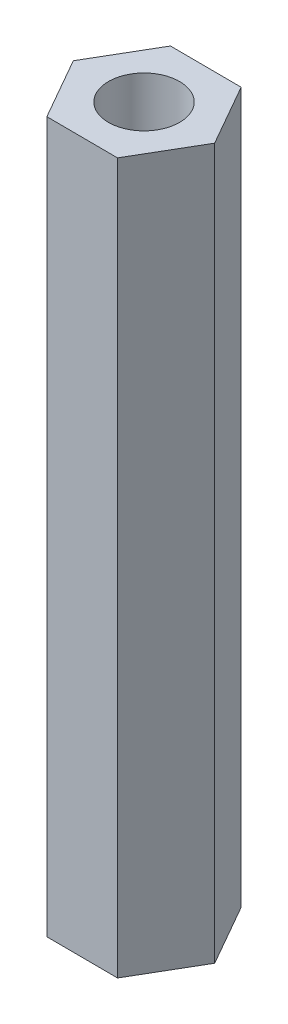
ISO-10303-21;
HEADER;
FILE_DESCRIPTION(('STEP AP214'),'2;1');
FILE_NAME('part.step','',(''),(''),'','','');
FILE_SCHEMA(('AUTOMOTIVE_DESIGN { 1 0 10303 214 1 1 1 1 }'));
ENDSEC;
DATA;
#1=APPLICATION_CONTEXT('core data for automotive mechanical design processes');
#2=APPLICATION_PROTOCOL_DEFINITION('international standard','automotive_design',2000,#1);
#3=PRODUCT_CONTEXT('',#1,'mechanical');
#4=PRODUCT('Part','Part','',(#3));
#5=PRODUCT_RELATED_PRODUCT_CATEGORY('part','',(#4));
#6=PRODUCT_DEFINITION_FORMATION('','',#4);
#7=PRODUCT_DEFINITION_CONTEXT('part definition',#1,'design');
#8=PRODUCT_DEFINITION('design','',#6,#7);
#9=PRODUCT_DEFINITION_SHAPE('','',#8);
#10=(LENGTH_UNIT() NAMED_UNIT(*) SI_UNIT(.MILLI.,.METRE.));
#11=(NAMED_UNIT(*) PLANE_ANGLE_UNIT() SI_UNIT($,.RADIAN.));
#12=(NAMED_UNIT(*) SI_UNIT($,.STERADIAN.) SOLID_ANGLE_UNIT());
#13=UNCERTAINTY_MEASURE_WITH_UNIT(LENGTH_MEASURE(1.E-05),#10,'distance_accuracy_value','');
#14=(GEOMETRIC_REPRESENTATION_CONTEXT(3) GLOBAL_UNCERTAINTY_ASSIGNED_CONTEXT((#13)) GLOBAL_UNIT_ASSIGNED_CONTEXT((#10,
#11,#12)) REPRESENTATION_CONTEXT('',''));
#15=CARTESIAN_POINT('',(0.,0.,0.));
#16=DIRECTION('',(0.,0.,1.));
#17=DIRECTION('',(1.,0.,0.));
#18=AXIS2_PLACEMENT_3D('',#15,#16,#17);
#19=CARTESIAN_POINT('',(0.,30.,0.));
#20=DIRECTION('',(0.,1.,0.));
#21=DIRECTION('',(0.,0.,1.));
#22=AXIS2_PLACEMENT_3D('',#19,#20,#21);
#23=PLANE('',#22);
#24=DIRECTION('',(-0.495581207532664,0.,-0.868561607913029));
#25=VECTOR('',#24,1.);
#26=CARTESIAN_POINT('',(3.,30.,0.0152848641678761));
#27=LINE('',#26,#25);
#28=CARTESIAN_POINT('',(3.,30.,0.0152848641678761));
#29=VERTEX_POINT('',#28);
#30=CARTESIAN_POINT('',(1.51323708066278,30.,-2.59043377926938));
#31=VERTEX_POINT('',#30);
#32=EDGE_CURVE('E128',#29,#31,#27,.T.);
#33=ORIENTED_EDGE('',*,*,#32,.T.);
#34=DIRECTION('',(-0.999987020970874,0.,-0.00509488859505963));
#35=VECTOR('',#34,1.);
#36=CARTESIAN_POINT('',(1.51323708066278,30.,-2.59043377926938));
#37=LINE('',#36,#35);
#38=CARTESIAN_POINT('',(-1.48676291933722,30.,-2.60571864343726));
#39=VERTEX_POINT('',#38);
#40=EDGE_CURVE('E86',#31,#39,#37,.T.);
#41=ORIENTED_EDGE('',*,*,#40,.T.);
#42=DIRECTION('',(-0.50440581343821,0.,0.86346671931797));
#43=VECTOR('',#42,1.);
#44=CARTESIAN_POINT('',(-1.48676291933722,30.,-2.60571864343726));
#45=LINE('',#44,#43);
#46=CARTESIAN_POINT('',(-3.,30.,-0.0152848641678757));
#47=VERTEX_POINT('',#46);
#48=EDGE_CURVE('E99',#39,#47,#45,.T.);
#49=ORIENTED_EDGE('',*,*,#48,.T.);
#50=DIRECTION('',(0.495581207532664,0.,0.868561607913029));
#51=VECTOR('',#50,1.);
#52=CARTESIAN_POINT('',(-3.,30.,-0.0152848641678757));
#53=LINE('',#52,#51);
#54=CARTESIAN_POINT('',(-1.51323708066278,30.,2.59043377926938));
#55=VERTEX_POINT('',#54);
#56=EDGE_CURVE('E93',#47,#55,#53,.T.);
#57=ORIENTED_EDGE('',*,*,#56,.T.);
#58=DIRECTION('',(0.999987020970874,0.,0.00509488859505963));
#59=VECTOR('',#58,1.);
#60=CARTESIAN_POINT('',(-1.51323708066278,30.,2.59043377926938));
#61=LINE('',#60,#59);
#62=CARTESIAN_POINT('',(1.48676291933723,30.,2.60571864343726));
#63=VERTEX_POINT('',#62);
#64=EDGE_CURVE('E97',#55,#63,#61,.T.);
#65=ORIENTED_EDGE('',*,*,#64,.T.);
#66=DIRECTION('',(0.504405813438211,0.,-0.86346671931797));
#67=VECTOR('',#66,1.);
#68=CARTESIAN_POINT('',(1.48676291933723,30.,2.60571864343726));
#69=LINE('',#68,#67);
#70=EDGE_CURVE('E49',#63,#29,#69,.T.);
#71=ORIENTED_EDGE('',*,*,#70,.T.);
#72=EDGE_LOOP('',(#33,#41,#49,#57,#65,#71));
#73=FACE_BOUND('',#72,.T.);
#74=CARTESIAN_POINT('',(0.,30.,0.));
#75=DIRECTION('',(0.,1.,0.));
#76=DIRECTION('',(0.,0.,1.));
#77=AXIS2_PLACEMENT_3D('',#74,#75,#76);
#78=CIRCLE('',#77,1.5);
#79=CARTESIAN_POINT('',(0.,30.,1.5));
#80=VERTEX_POINT('',#79);
#81=EDGE_CURVE('E121',#80,#80,#78,.T.);
#82=ORIENTED_EDGE('',*,*,#81,.F.);
#83=EDGE_LOOP('',(#82));
#84=FACE_BOUND('',#83,.T.);
#85=ADVANCED_FACE('F32',(#73,#84),#23,.T.);
#86=CARTESIAN_POINT('',(0.,0.,0.));
#87=DIRECTION('',(0.,1.,0.));
#88=DIRECTION('',(0.,0.,1.));
#89=AXIS2_PLACEMENT_3D('',#86,#87,#88);
#90=PLANE('',#89);
#91=DIRECTION('',(-0.495581207532664,0.,-0.868561607913029));
#92=VECTOR('',#91,1.);
#93=CARTESIAN_POINT('',(3.,0.,0.0152848641678761));
#94=LINE('',#93,#92);
#95=CARTESIAN_POINT('',(3.,0.,0.0152848641678761));
#96=VERTEX_POINT('',#95);
#97=CARTESIAN_POINT('',(1.51323708066278,0.,-2.59043377926938));
#98=VERTEX_POINT('',#97);
#99=EDGE_CURVE('E117',#96,#98,#94,.T.);
#100=ORIENTED_EDGE('',*,*,#99,.F.);
#101=DIRECTION('',(0.504405813438211,0.,-0.86346671931797));
#102=VECTOR('',#101,1.);
#103=CARTESIAN_POINT('',(1.48676291933723,0.,2.60571864343726));
#104=LINE('',#103,#102);
#105=CARTESIAN_POINT('',(1.48676291933723,0.,2.60571864343726));
#106=VERTEX_POINT('',#105);
#107=EDGE_CURVE('E78',#106,#96,#104,.T.);
#108=ORIENTED_EDGE('',*,*,#107,.F.);
#109=DIRECTION('',(0.999987020970874,0.,0.00509488859505963));
#110=VECTOR('',#109,1.);
#111=CARTESIAN_POINT('',(-1.51323708066278,0.,2.59043377926938));
#112=LINE('',#111,#110);
#113=CARTESIAN_POINT('',(-1.51323708066278,0.,2.59043377926938));
#114=VERTEX_POINT('',#113);
#115=EDGE_CURVE('E72',#114,#106,#112,.T.);
#116=ORIENTED_EDGE('',*,*,#115,.F.);
#117=DIRECTION('',(0.495581207532664,0.,0.868561607913029));
#118=VECTOR('',#117,1.);
#119=CARTESIAN_POINT('',(-3.,0.,-0.0152848641678757));
#120=LINE('',#119,#118);
#121=CARTESIAN_POINT('',(-3.,0.,-0.0152848641678757));
#122=VERTEX_POINT('',#121);
#123=EDGE_CURVE('E107',#122,#114,#120,.T.);
#124=ORIENTED_EDGE('',*,*,#123,.F.);
#125=DIRECTION('',(-0.50440581343821,0.,0.86346671931797));
#126=VECTOR('',#125,1.);
#127=CARTESIAN_POINT('',(-1.48676291933722,0.,-2.60571864343726));
#128=LINE('',#127,#126);
#129=CARTESIAN_POINT('',(-1.48676291933722,0.,-2.60571864343726));
#130=VERTEX_POINT('',#129);
#131=EDGE_CURVE('E123',#130,#122,#128,.T.);
#132=ORIENTED_EDGE('',*,*,#131,.F.);
#133=DIRECTION('',(-0.999987020970874,0.,-0.00509488859505963));
#134=VECTOR('',#133,1.);
#135=CARTESIAN_POINT('',(1.51323708066278,0.,-2.59043377926938));
#136=LINE('',#135,#134);
#137=EDGE_CURVE('E120',#98,#130,#136,.T.);
#138=ORIENTED_EDGE('',*,*,#137,.F.);
#139=EDGE_LOOP('',(#100,#108,#116,#124,#132,#138));
#140=FACE_BOUND('',#139,.T.);
#141=CARTESIAN_POINT('',(0.,0.,0.));
#142=DIRECTION('',(0.,1.,0.));
#143=DIRECTION('',(0.,0.,1.));
#144=AXIS2_PLACEMENT_3D('',#141,#142,#143);
#145=CIRCLE('',#144,1.5);
#146=CARTESIAN_POINT('',(0.,0.,1.5));
#147=VERTEX_POINT('',#146);
#148=EDGE_CURVE('E221',#147,#147,#145,.T.);
#149=ORIENTED_EDGE('',*,*,#148,.T.);
#150=EDGE_LOOP('',(#149));
#151=FACE_BOUND('',#150,.T.);
#152=ADVANCED_FACE('F137',(#140,#151),#90,.F.);
#153=CARTESIAN_POINT('',(3.,30.,0.0152848641678761));
#154=DIRECTION('',(-0.868561607913029,0.,0.495581207532664));
#155=DIRECTION('',(0.495581207532664,0.,0.868561607913029));
#156=AXIS2_PLACEMENT_3D('',#153,#154,#155);
#157=PLANE('',#156);
#158=ORIENTED_EDGE('',*,*,#99,.T.);
#159=DIRECTION('',(0.,-1.,0.));
#160=VECTOR('',#159,1.);
#161=CARTESIAN_POINT('',(1.51323708066278,30.,-2.59043377926938));
#162=LINE('',#161,#160);
#163=EDGE_CURVE('E11',#31,#98,#162,.T.);
#164=ORIENTED_EDGE('',*,*,#163,.F.);
#165=ORIENTED_EDGE('',*,*,#32,.F.);
#166=DIRECTION('',(0.,-1.,0.));
#167=VECTOR('',#166,1.);
#168=CARTESIAN_POINT('',(3.,30.,0.0152848641678761));
#169=LINE('',#168,#167);
#170=EDGE_CURVE('E113',#29,#96,#169,.T.);
#171=ORIENTED_EDGE('',*,*,#170,.T.);
#172=EDGE_LOOP('',(#158,#164,#165,#171));
#173=FACE_BOUND('',#172,.T.);
#174=ADVANCED_FACE('F34',(#173),#157,.F.);
#175=CARTESIAN_POINT('',(1.51323708066278,30.,-2.59043377926938));
#176=DIRECTION('',(-0.00509488859505963,0.,0.999987020970874));
#177=DIRECTION('',(0.999987020970874,0.,0.00509488859505963));
#178=AXIS2_PLACEMENT_3D('',#175,#176,#177);
#179=PLANE('',#178);
#180=ORIENTED_EDGE('',*,*,#137,.T.);
#181=DIRECTION('',(0.,-1.,0.));
#182=VECTOR('',#181,1.);
#183=CARTESIAN_POINT('',(-1.48676291933722,30.,-2.60571864343726));
#184=LINE('',#183,#182);
#185=EDGE_CURVE('E41',#39,#130,#184,.T.);
#186=ORIENTED_EDGE('',*,*,#185,.F.);
#187=ORIENTED_EDGE('',*,*,#40,.F.);
#188=ORIENTED_EDGE('',*,*,#163,.T.);
#189=EDGE_LOOP('',(#180,#186,#187,#188));
#190=FACE_BOUND('',#189,.T.);
#191=ADVANCED_FACE('F162',(#190),#179,.F.);
#192=CARTESIAN_POINT('',(-1.48676291933722,30.,-2.60571864343726));
#193=DIRECTION('',(0.86346671931797,0.,0.50440581343821));
#194=DIRECTION('',(0.50440581343821,0.,-0.86346671931797));
#195=AXIS2_PLACEMENT_3D('',#192,#193,#194);
#196=PLANE('',#195);
#197=ORIENTED_EDGE('',*,*,#131,.T.);
#198=DIRECTION('',(0.,-1.,0.));
#199=VECTOR('',#198,1.);
#200=CARTESIAN_POINT('',(-3.,30.,-0.0152848641678757));
#201=LINE('',#200,#199);
#202=EDGE_CURVE('E108',#47,#122,#201,.T.);
#203=ORIENTED_EDGE('',*,*,#202,.F.);
#204=ORIENTED_EDGE('',*,*,#48,.F.);
#205=ORIENTED_EDGE('',*,*,#185,.T.);
#206=EDGE_LOOP('',(#197,#203,#204,#205));
#207=FACE_BOUND('',#206,.T.);
#208=ADVANCED_FACE('F134',(#207),#196,.F.);
#209=CARTESIAN_POINT('',(-3.,30.,-0.0152848641678757));
#210=DIRECTION('',(0.868561607913029,0.,-0.495581207532664));
#211=DIRECTION('',(-0.495581207532664,0.,-0.868561607913029));
#212=AXIS2_PLACEMENT_3D('',#209,#210,#211);
#213=PLANE('',#212);
#214=ORIENTED_EDGE('',*,*,#123,.T.);
#215=DIRECTION('',(0.,-1.,0.));
#216=VECTOR('',#215,1.);
#217=CARTESIAN_POINT('',(-1.51323708066278,30.,2.59043377926938));
#218=LINE('',#217,#216);
#219=EDGE_CURVE('E104',#55,#114,#218,.T.);
#220=ORIENTED_EDGE('',*,*,#219,.F.);
#221=ORIENTED_EDGE('',*,*,#56,.F.);
#222=ORIENTED_EDGE('',*,*,#202,.T.);
#223=EDGE_LOOP('',(#214,#220,#221,#222));
#224=FACE_BOUND('',#223,.T.);
#225=ADVANCED_FACE('F105',(#224),#213,.F.);
#226=CARTESIAN_POINT('',(-1.51323708066278,30.,2.59043377926938));
#227=DIRECTION('',(0.00509488859505963,0.,-0.999987020970874));
#228=DIRECTION('',(-0.999987020970874,0.,-0.00509488859505963));
#229=AXIS2_PLACEMENT_3D('',#226,#227,#228);
#230=PLANE('',#229);
#231=ORIENTED_EDGE('',*,*,#115,.T.);
#232=DIRECTION('',(0.,-1.,0.));
#233=VECTOR('',#232,1.);
#234=CARTESIAN_POINT('',(1.48676291933723,30.,2.60571864343726));
#235=LINE('',#234,#233);
#236=EDGE_CURVE('E109',#63,#106,#235,.T.);
#237=ORIENTED_EDGE('',*,*,#236,.F.);
#238=ORIENTED_EDGE('',*,*,#64,.F.);
#239=ORIENTED_EDGE('',*,*,#219,.T.);
#240=EDGE_LOOP('',(#231,#237,#238,#239));
#241=FACE_BOUND('',#240,.T.);
#242=ADVANCED_FACE('F111',(#241),#230,.F.);
#243=CARTESIAN_POINT('',(1.48676291933723,30.,2.60571864343726));
#244=DIRECTION('',(-0.86346671931797,0.,-0.504405813438211));
#245=DIRECTION('',(-0.504405813438211,0.,0.86346671931797));
#246=AXIS2_PLACEMENT_3D('',#243,#244,#245);
#247=PLANE('',#246);
#248=ORIENTED_EDGE('',*,*,#107,.T.);
#249=ORIENTED_EDGE('',*,*,#170,.F.);
#250=ORIENTED_EDGE('',*,*,#70,.F.);
#251=ORIENTED_EDGE('',*,*,#236,.T.);
#252=EDGE_LOOP('',(#248,#249,#250,#251));
#253=FACE_BOUND('',#252,.T.);
#254=ADVANCED_FACE('F142',(#253),#247,.F.);
#255=CARTESIAN_POINT('',(0.,30.,0.));
#256=DIRECTION('',(0.,-1.,0.));
#257=DIRECTION('',(0.,0.,-1.));
#258=AXIS2_PLACEMENT_3D('',#255,#256,#257);
#259=CYLINDRICAL_SURFACE('',#258,1.5);
#260=ORIENTED_EDGE('',*,*,#81,.T.);
#261=EDGE_LOOP('',(#260));
#262=FACE_BOUND('',#261,.T.);
#263=ORIENTED_EDGE('',*,*,#148,.F.);
#264=EDGE_LOOP('',(#263));
#265=FACE_BOUND('',#264,.T.);
#266=ADVANCED_FACE('F144',(#262,#265),#259,.F.);
#267=CLOSED_SHELL('',(#85,#152,#174,#191,#208,#225,#242,#254,#266));
#268=MANIFOLD_SOLID_BREP('B2',#267);
#269=ADVANCED_BREP_SHAPE_REPRESENTATION('',(#18,#268),#14);
#270=SHAPE_DEFINITION_REPRESENTATION(#9,#269);
ENDSEC;
END-ISO-10303-21;
